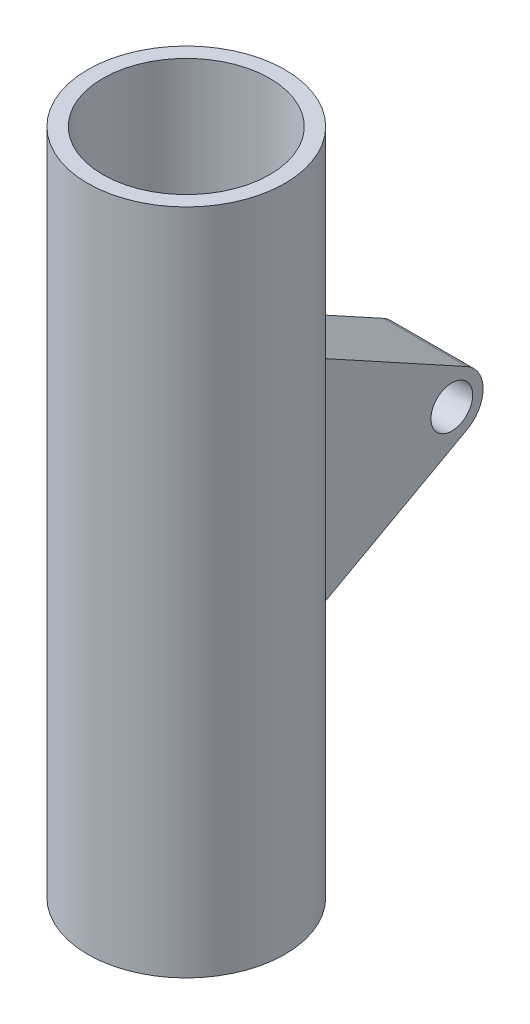
ISO-10303-21;
HEADER;
FILE_DESCRIPTION(('STEP AP214'),'2;1');
FILE_NAME('part.step','',(''),(''),'','','');
FILE_SCHEMA(('AUTOMOTIVE_DESIGN { 1 0 10303 214 1 1 1 1 }'));
ENDSEC;
DATA;
#1=APPLICATION_CONTEXT('core data for automotive mechanical design processes');
#2=APPLICATION_PROTOCOL_DEFINITION('international standard','automotive_design',2000,#1);
#3=PRODUCT_CONTEXT('',#1,'mechanical');
#4=PRODUCT('Part','Part','',(#3));
#5=PRODUCT_RELATED_PRODUCT_CATEGORY('part','',(#4));
#6=PRODUCT_DEFINITION_FORMATION('','',#4);
#7=PRODUCT_DEFINITION_CONTEXT('part definition',#1,'design');
#8=PRODUCT_DEFINITION('design','',#6,#7);
#9=PRODUCT_DEFINITION_SHAPE('','',#8);
#10=(LENGTH_UNIT() NAMED_UNIT(*) SI_UNIT(.MILLI.,.METRE.));
#11=(NAMED_UNIT(*) PLANE_ANGLE_UNIT() SI_UNIT($,.RADIAN.));
#12=(NAMED_UNIT(*) SI_UNIT($,.STERADIAN.) SOLID_ANGLE_UNIT());
#13=UNCERTAINTY_MEASURE_WITH_UNIT(LENGTH_MEASURE(1.E-05),#10,'distance_accuracy_value','');
#14=(GEOMETRIC_REPRESENTATION_CONTEXT(3) GLOBAL_UNCERTAINTY_ASSIGNED_CONTEXT((#13)) GLOBAL_UNIT_ASSIGNED_CONTEXT((#10,
#11,#12)) REPRESENTATION_CONTEXT('',''));
#15=CARTESIAN_POINT('',(0.,0.,0.));
#16=DIRECTION('',(0.,0.,1.));
#17=DIRECTION('',(1.,0.,0.));
#18=AXIS2_PLACEMENT_3D('',#15,#16,#17);
#19=CARTESIAN_POINT('',(-12.7,69.85,-80.8));
#20=DIRECTION('',(1.,0.,0.));
#21=DIRECTION('',(0.,1.,0.));
#22=AXIS2_PLACEMENT_3D('',#19,#20,#21);
#23=PLANE('',#22);
#24=CARTESIAN_POINT('',(-12.7,101.6,-68.1));
#25=DIRECTION('',(1.,0.,0.));
#26=DIRECTION('',(0.,1.,0.));
#27=AXIS2_PLACEMENT_3D('',#24,#25,#26);
#28=CIRCLE('',#27,9.52500000000001);
#29=CARTESIAN_POINT('',(-12.7,109.952195986169,-72.6789133218074));
#30=VERTEX_POINT('',#29);
#31=CARTESIAN_POINT('',(-12.7,93.2478040138311,-72.6789133218074));
#32=VERTEX_POINT('',#31);
#33=EDGE_CURVE('E147',#30,#32,#28,.F.);
#34=ORIENTED_EDGE('',*,*,#33,.T.);
#35=DIRECTION('',(0.,-0.480725808063766,0.876870969676519));
#36=VECTOR('',#35,1.);
#37=CARTESIAN_POINT('',(-12.7,41.0618182537194,22.5112661306016));
#38=LINE('',#37,#36);
#39=CARTESIAN_POINT('',(-12.7,69.85,-30.));
#40=VERTEX_POINT('',#39);
#41=EDGE_CURVE('E146',#32,#40,#38,.T.);
#42=ORIENTED_EDGE('',*,*,#41,.T.);
#43=DIRECTION('',(0.,0.,1.));
#44=VECTOR('',#43,1.);
#45=CARTESIAN_POINT('',(-12.7,69.85,-80.8));
#46=LINE('',#45,#44);
#47=CARTESIAN_POINT('',(-12.7,69.85,-27.1792200035247));
#48=VERTEX_POINT('',#47);
#49=EDGE_CURVE('E201',#40,#48,#46,.T.);
#50=ORIENTED_EDGE('',*,*,#49,.T.);
#51=DIRECTION('',(0.,-1.,0.));
#52=VECTOR('',#51,1.);
#53=CARTESIAN_POINT('',(-12.7,203.2,-27.1792200035247));
#54=LINE('',#53,#52);
#55=CARTESIAN_POINT('',(-12.7,133.35,-27.1792200035247));
#56=VERTEX_POINT('',#55);
#57=EDGE_CURVE('E156',#48,#56,#54,.F.);
#58=ORIENTED_EDGE('',*,*,#57,.T.);
#59=DIRECTION('',(0.,0.,1.));
#60=VECTOR('',#59,1.);
#61=CARTESIAN_POINT('',(-12.7,133.35,-80.8));
#62=LINE('',#61,#60);
#63=CARTESIAN_POINT('',(-12.7,133.35,-30.));
#64=VERTEX_POINT('',#63);
#65=EDGE_CURVE('E99',#64,#56,#62,.T.);
#66=ORIENTED_EDGE('',*,*,#65,.F.);
#67=DIRECTION('',(0.,0.480725808063766,0.876870969676519));
#68=VECTOR('',#67,1.);
#69=CARTESIAN_POINT('',(-12.7,115.179209870445,-63.1445453799683));
#70=LINE('',#69,#68);
#71=EDGE_CURVE('E137',#30,#64,#70,.T.);
#72=ORIENTED_EDGE('',*,*,#71,.F.);
#73=EDGE_LOOP('',(#34,#42,#50,#58,#66,#72));
#74=FACE_BOUND('',#73,.T.);
#75=CARTESIAN_POINT('',(-12.7,101.6,-68.1));
#76=DIRECTION('',(1.,0.,0.));
#77=DIRECTION('',(0.,1.,0.));
#78=AXIS2_PLACEMENT_3D('',#75,#76,#77);
#79=CIRCLE('',#78,6.34999999999999);
#80=CARTESIAN_POINT('',(-12.7,107.95,-68.1));
#81=VERTEX_POINT('',#80);
#82=EDGE_CURVE('E218',#81,#81,#79,.F.);
#83=ORIENTED_EDGE('',*,*,#82,.F.);
#84=EDGE_LOOP('',(#83));
#85=FACE_BOUND('',#84,.T.);
#86=ADVANCED_FACE('F75',(#74,#85),#23,.F.);
#87=CARTESIAN_POINT('',(12.7,133.35,-80.8));
#88=DIRECTION('',(0.,-1.,0.));
#89=DIRECTION('',(0.,0.,-1.));
#90=AXIS2_PLACEMENT_3D('',#87,#88,#89);
#91=PLANE('',#90);
#92=DIRECTION('',(-1.,0.,0.));
#93=VECTOR('',#92,1.);
#94=CARTESIAN_POINT('',(30.,133.35,-30.));
#95=LINE('',#94,#93);
#96=CARTESIAN_POINT('',(0.,133.35,-30.));
#97=VERTEX_POINT('',#96);
#98=EDGE_CURVE('E139',#97,#64,#95,.T.);
#99=ORIENTED_EDGE('',*,*,#98,.T.);
#100=ORIENTED_EDGE('',*,*,#65,.T.);
#101=CARTESIAN_POINT('',(0.,133.35,0.));
#102=DIRECTION('',(0.,1.,0.));
#103=DIRECTION('',(0.,0.,1.));
#104=AXIS2_PLACEMENT_3D('',#101,#102,#103);
#105=CIRCLE('',#104,30.);
#106=EDGE_CURVE('E150',#56,#97,#105,.F.);
#107=ORIENTED_EDGE('',*,*,#106,.T.);
#108=EDGE_LOOP('',(#99,#100,#107));
#109=FACE_BOUND('',#108,.T.);
#110=ADVANCED_FACE('F149',(#109),#91,.F.);
#111=CARTESIAN_POINT('',(12.7,133.35,-30.));
#112=VERTEX_POINT('',#111);
#113=EDGE_CURVE('E151',#112,#97,#95,.T.);
#114=ORIENTED_EDGE('',*,*,#113,.T.);
#115=CARTESIAN_POINT('',(12.7,133.35,-27.1792200035248));
#116=VERTEX_POINT('',#115);
#117=EDGE_CURVE('E194',#97,#116,#105,.F.);
#118=ORIENTED_EDGE('',*,*,#117,.T.);
#119=DIRECTION('',(0.,0.,1.));
#120=VECTOR('',#119,1.);
#121=CARTESIAN_POINT('',(12.7,133.35,-80.8));
#122=LINE('',#121,#120);
#123=EDGE_CURVE('E158',#112,#116,#122,.T.);
#124=ORIENTED_EDGE('',*,*,#123,.F.);
#125=EDGE_LOOP('',(#114,#118,#124));
#126=FACE_BOUND('',#125,.T.);
#127=ADVANCED_FACE('F212',(#126),#91,.F.);
#128=CARTESIAN_POINT('',(12.7,69.85,-80.8));
#129=DIRECTION('',(-1.,0.,0.));
#130=DIRECTION('',(0.,-1.,0.));
#131=AXIS2_PLACEMENT_3D('',#128,#129,#130);
#132=PLANE('',#131);
#133=DIRECTION('',(0.,0.,1.));
#134=VECTOR('',#133,1.);
#135=CARTESIAN_POINT('',(12.7,69.85,-80.8));
#136=LINE('',#135,#134);
#137=CARTESIAN_POINT('',(12.7,69.85,-30.));
#138=VERTEX_POINT('',#137);
#139=CARTESIAN_POINT('',(12.7,69.85,-27.1792200035248));
#140=VERTEX_POINT('',#139);
#141=EDGE_CURVE('E164',#138,#140,#136,.T.);
#142=ORIENTED_EDGE('',*,*,#141,.F.);
#143=DIRECTION('',(0.,0.480725808063766,-0.876870969676519));
#144=VECTOR('',#143,1.);
#145=CARTESIAN_POINT('',(12.7,91.2639528776425,-69.0602570310411));
#146=LINE('',#145,#144);
#147=CARTESIAN_POINT('',(12.7,93.2478040138311,-72.6789133218074));
#148=VERTEX_POINT('',#147);
#149=EDGE_CURVE('E91',#138,#148,#146,.T.);
#150=ORIENTED_EDGE('',*,*,#149,.T.);
#151=CARTESIAN_POINT('',(12.7,101.6,-68.1));
#152=DIRECTION('',(-1.,0.,0.));
#153=DIRECTION('',(0.,-1.,0.));
#154=AXIS2_PLACEMENT_3D('',#151,#152,#153);
#155=CIRCLE('',#154,9.52500000000001);
#156=CARTESIAN_POINT('',(12.7,109.952195986169,-72.6789133218074));
#157=VERTEX_POINT('',#156);
#158=EDGE_CURVE('E12',#148,#157,#155,.F.);
#159=ORIENTED_EDGE('',*,*,#158,.T.);
#160=DIRECTION('',(0.,-0.480725808063766,-0.876870969676519));
#161=VECTOR('',#160,1.);
#162=CARTESIAN_POINT('',(12.7,97.2613684111589,-95.8276981280942));
#163=LINE('',#162,#161);
#164=EDGE_CURVE('E84',#112,#157,#163,.T.);
#165=ORIENTED_EDGE('',*,*,#164,.F.);
#166=ORIENTED_EDGE('',*,*,#123,.T.);
#167=DIRECTION('',(0.,-1.,0.));
#168=VECTOR('',#167,1.);
#169=CARTESIAN_POINT('',(12.7,203.2,-27.1792200035248));
#170=LINE('',#169,#168);
#171=EDGE_CURVE('E195',#116,#140,#170,.T.);
#172=ORIENTED_EDGE('',*,*,#171,.T.);
#173=EDGE_LOOP('',(#142,#150,#159,#165,#166,#172));
#174=FACE_BOUND('',#173,.T.);
#175=CARTESIAN_POINT('',(12.7,101.6,-68.1));
#176=DIRECTION('',(-1.,0.,0.));
#177=DIRECTION('',(0.,-1.,0.));
#178=AXIS2_PLACEMENT_3D('',#175,#176,#177);
#179=CIRCLE('',#178,6.34999999999999);
#180=CARTESIAN_POINT('',(12.7,95.25,-68.1));
#181=VERTEX_POINT('',#180);
#182=EDGE_CURVE('E79',#181,#181,#179,.F.);
#183=ORIENTED_EDGE('',*,*,#182,.F.);
#184=EDGE_LOOP('',(#183));
#185=FACE_BOUND('',#184,.T.);
#186=ADVANCED_FACE('F183',(#174,#185),#132,.F.);
#187=CARTESIAN_POINT('',(12.7,69.85,-80.8));
#188=DIRECTION('',(0.,1.,0.));
#189=DIRECTION('',(0.,0.,1.));
#190=AXIS2_PLACEMENT_3D('',#187,#188,#189);
#191=PLANE('',#190);
#192=ORIENTED_EDGE('',*,*,#49,.F.);
#193=DIRECTION('',(-1.,0.,0.));
#194=VECTOR('',#193,1.);
#195=CARTESIAN_POINT('',(30.,69.85,-30.));
#196=LINE('',#195,#194);
#197=CARTESIAN_POINT('',(0.,69.85,-30.));
#198=VERTEX_POINT('',#197);
#199=EDGE_CURVE('E213',#198,#40,#196,.T.);
#200=ORIENTED_EDGE('',*,*,#199,.F.);
#201=CARTESIAN_POINT('',(0.,69.85,0.));
#202=DIRECTION('',(0.,-1.,0.));
#203=DIRECTION('',(0.,0.,-1.));
#204=AXIS2_PLACEMENT_3D('',#201,#202,#203);
#205=CIRCLE('',#204,30.);
#206=EDGE_CURVE('E197',#198,#48,#205,.F.);
#207=ORIENTED_EDGE('',*,*,#206,.T.);
#208=EDGE_LOOP('',(#192,#200,#207));
#209=FACE_BOUND('',#208,.T.);
#210=ADVANCED_FACE('F251',(#209),#191,.F.);
#211=CARTESIAN_POINT('',(0.,203.2,0.));
#212=DIRECTION('',(0.,-1.,0.));
#213=DIRECTION('',(0.,0.,-1.));
#214=AXIS2_PLACEMENT_3D('',#211,#212,#213);
#215=CYLINDRICAL_SURFACE('',#214,30.);
#216=CARTESIAN_POINT('',(0.,0.,0.));
#217=DIRECTION('',(0.,1.,0.));
#218=DIRECTION('',(0.,0.,1.));
#219=AXIS2_PLACEMENT_3D('',#216,#217,#218);
#220=CIRCLE('',#219,30.);
#221=CARTESIAN_POINT('',(0.,0.,30.));
#222=VERTEX_POINT('',#221);
#223=EDGE_CURVE('E169',#222,#222,#220,.T.);
#224=ORIENTED_EDGE('',*,*,#223,.T.);
#225=EDGE_LOOP('',(#224));
#226=FACE_BOUND('',#225,.T.);
#227=CARTESIAN_POINT('',(0.,203.2,0.));
#228=DIRECTION('',(0.,1.,0.));
#229=DIRECTION('',(0.,0.,1.));
#230=AXIS2_PLACEMENT_3D('',#227,#228,#229);
#231=CIRCLE('',#230,30.);
#232=CARTESIAN_POINT('',(0.,203.2,30.));
#233=VERTEX_POINT('',#232);
#234=EDGE_CURVE('E171',#233,#233,#231,.T.);
#235=ORIENTED_EDGE('',*,*,#234,.F.);
#236=EDGE_LOOP('',(#235));
#237=FACE_BOUND('',#236,.T.);
#238=ORIENTED_EDGE('',*,*,#57,.F.);
#239=ORIENTED_EDGE('',*,*,#206,.F.);
#240=EDGE_CURVE('E198',#140,#198,#205,.F.);
#241=ORIENTED_EDGE('',*,*,#240,.F.);
#242=ORIENTED_EDGE('',*,*,#171,.F.);
#243=ORIENTED_EDGE('',*,*,#117,.F.);
#244=ORIENTED_EDGE('',*,*,#106,.F.);
#245=EDGE_LOOP('',(#238,#239,#241,#242,#243,#244));
#246=FACE_BOUND('',#245,.T.);
#247=ADVANCED_FACE('F77',(#226,#237,#246),#215,.T.);
#248=CARTESIAN_POINT('',(0.,203.2,0.));
#249=DIRECTION('',(0.,1.,0.));
#250=DIRECTION('',(0.,0.,1.));
#251=AXIS2_PLACEMENT_3D('',#248,#249,#250);
#252=PLANE('',#251);
#253=ORIENTED_EDGE('',*,*,#234,.T.);
#254=EDGE_LOOP('',(#253));
#255=FACE_BOUND('',#254,.T.);
#256=CARTESIAN_POINT('',(0.,203.2,0.));
#257=DIRECTION('',(0.,1.,0.));
#258=DIRECTION('',(0.,0.,1.));
#259=AXIS2_PLACEMENT_3D('',#256,#257,#258);
#260=CIRCLE('',#259,25.4);
#261=CARTESIAN_POINT('',(0.,203.2,25.4));
#262=VERTEX_POINT('',#261);
#263=EDGE_CURVE('E161',#262,#262,#260,.T.);
#264=ORIENTED_EDGE('',*,*,#263,.F.);
#265=EDGE_LOOP('',(#264));
#266=FACE_BOUND('',#265,.T.);
#267=ADVANCED_FACE('F237',(#255,#266),#252,.T.);
#268=CARTESIAN_POINT('',(0.,0.,0.));
#269=DIRECTION('',(0.,1.,0.));
#270=DIRECTION('',(0.,0.,1.));
#271=AXIS2_PLACEMENT_3D('',#268,#269,#270);
#272=PLANE('',#271);
#273=ORIENTED_EDGE('',*,*,#223,.F.);
#274=EDGE_LOOP('',(#273));
#275=FACE_BOUND('',#274,.T.);
#276=CARTESIAN_POINT('',(0.,0.,0.));
#277=DIRECTION('',(0.,1.,0.));
#278=DIRECTION('',(0.,0.,1.));
#279=AXIS2_PLACEMENT_3D('',#276,#277,#278);
#280=CIRCLE('',#279,25.4);
#281=CARTESIAN_POINT('',(0.,0.,25.4));
#282=VERTEX_POINT('',#281);
#283=EDGE_CURVE('E157',#282,#282,#280,.T.);
#284=ORIENTED_EDGE('',*,*,#283,.T.);
#285=EDGE_LOOP('',(#284));
#286=FACE_BOUND('',#285,.T.);
#287=ADVANCED_FACE('F235',(#275,#286),#272,.F.);
#288=CARTESIAN_POINT('',(0.,203.2,0.));
#289=DIRECTION('',(0.,-1.,0.));
#290=DIRECTION('',(0.,0.,-1.));
#291=AXIS2_PLACEMENT_3D('',#288,#289,#290);
#292=CYLINDRICAL_SURFACE('',#291,25.4);
#293=ORIENTED_EDGE('',*,*,#263,.T.);
#294=EDGE_LOOP('',(#293));
#295=FACE_BOUND('',#294,.T.);
#296=ORIENTED_EDGE('',*,*,#283,.F.);
#297=EDGE_LOOP('',(#296));
#298=FACE_BOUND('',#297,.T.);
#299=ADVANCED_FACE('F232',(#295,#298),#292,.F.);
#300=ORIENTED_EDGE('',*,*,#240,.T.);
#301=EDGE_CURVE('E189',#138,#198,#196,.T.);
#302=ORIENTED_EDGE('',*,*,#301,.F.);
#303=ORIENTED_EDGE('',*,*,#141,.T.);
#304=EDGE_LOOP('',(#300,#302,#303));
#305=FACE_BOUND('',#304,.T.);
#306=ADVANCED_FACE('F205',(#305),#191,.F.);
#307=CARTESIAN_POINT('',(30.,101.6,-68.1));
#308=DIRECTION('',(-1.,0.,0.));
#309=DIRECTION('',(0.,-1.,0.));
#310=AXIS2_PLACEMENT_3D('',#307,#308,#309);
#311=CYLINDRICAL_SURFACE('',#310,9.52500000000001);
#312=DIRECTION('',(-1.,0.,0.));
#313=VECTOR('',#312,1.);
#314=CARTESIAN_POINT('',(30.,93.2478040138311,-72.6789133218074));
#315=LINE('',#314,#313);
#316=EDGE_CURVE('E186',#148,#32,#315,.T.);
#317=ORIENTED_EDGE('',*,*,#316,.T.);
#318=ORIENTED_EDGE('',*,*,#33,.F.);
#319=DIRECTION('',(-1.,0.,0.));
#320=VECTOR('',#319,1.);
#321=CARTESIAN_POINT('',(30.,109.952195986169,-72.6789133218074));
#322=LINE('',#321,#320);
#323=EDGE_CURVE('E142',#157,#30,#322,.T.);
#324=ORIENTED_EDGE('',*,*,#323,.F.);
#325=ORIENTED_EDGE('',*,*,#158,.F.);
#326=EDGE_LOOP('',(#317,#318,#324,#325));
#327=FACE_BOUND('',#326,.T.);
#328=ADVANCED_FACE('F180',(#327),#311,.T.);
#329=CARTESIAN_POINT('',(30.,115.179209870445,-63.1445453799683));
#330=DIRECTION('',(0.,0.876870969676519,-0.480725808063766));
#331=DIRECTION('',(0.,0.480725808063766,0.876870969676519));
#332=AXIS2_PLACEMENT_3D('',#329,#330,#331);
#333=PLANE('',#332);
#334=ORIENTED_EDGE('',*,*,#164,.T.);
#335=ORIENTED_EDGE('',*,*,#323,.T.);
#336=ORIENTED_EDGE('',*,*,#71,.T.);
#337=ORIENTED_EDGE('',*,*,#98,.F.);
#338=ORIENTED_EDGE('',*,*,#113,.F.);
#339=EDGE_LOOP('',(#334,#335,#336,#337,#338));
#340=FACE_BOUND('',#339,.T.);
#341=ADVANCED_FACE('F138',(#340),#333,.T.);
#342=CARTESIAN_POINT('',(30.,41.0618182537194,22.5112661306016));
#343=DIRECTION('',(0.,0.876870969676519,0.480725808063766));
#344=DIRECTION('',(0.,-0.480725808063766,0.876870969676519));
#345=AXIS2_PLACEMENT_3D('',#342,#343,#344);
#346=PLANE('',#345);
#347=ORIENTED_EDGE('',*,*,#301,.T.);
#348=ORIENTED_EDGE('',*,*,#199,.T.);
#349=ORIENTED_EDGE('',*,*,#41,.F.);
#350=ORIENTED_EDGE('',*,*,#316,.F.);
#351=ORIENTED_EDGE('',*,*,#149,.F.);
#352=EDGE_LOOP('',(#347,#348,#349,#350,#351));
#353=FACE_BOUND('',#352,.T.);
#354=ADVANCED_FACE('F272',(#353),#346,.F.);
#355=CARTESIAN_POINT('',(30.,101.6,-68.1));
#356=DIRECTION('',(-1.,0.,0.));
#357=DIRECTION('',(0.,-1.,0.));
#358=AXIS2_PLACEMENT_3D('',#355,#356,#357);
#359=CYLINDRICAL_SURFACE('',#358,6.34999999999999);
#360=ORIENTED_EDGE('',*,*,#82,.T.);
#361=EDGE_LOOP('',(#360));
#362=FACE_BOUND('',#361,.T.);
#363=ORIENTED_EDGE('',*,*,#182,.T.);
#364=EDGE_LOOP('',(#363));
#365=FACE_BOUND('',#364,.T.);
#366=ADVANCED_FACE('F222',(#362,#365),#359,.F.);
#367=CLOSED_SHELL('',(#86,#110,#127,#186,#210,#247,#267,#287,#299,#306,#328,#341,#354,#366));
#368=MANIFOLD_SOLID_BREP('B2',#367);
#369=ADVANCED_BREP_SHAPE_REPRESENTATION('',(#18,#368),#14);
#370=SHAPE_DEFINITION_REPRESENTATION(#9,#369);
ENDSEC;
END-ISO-10303-21;
